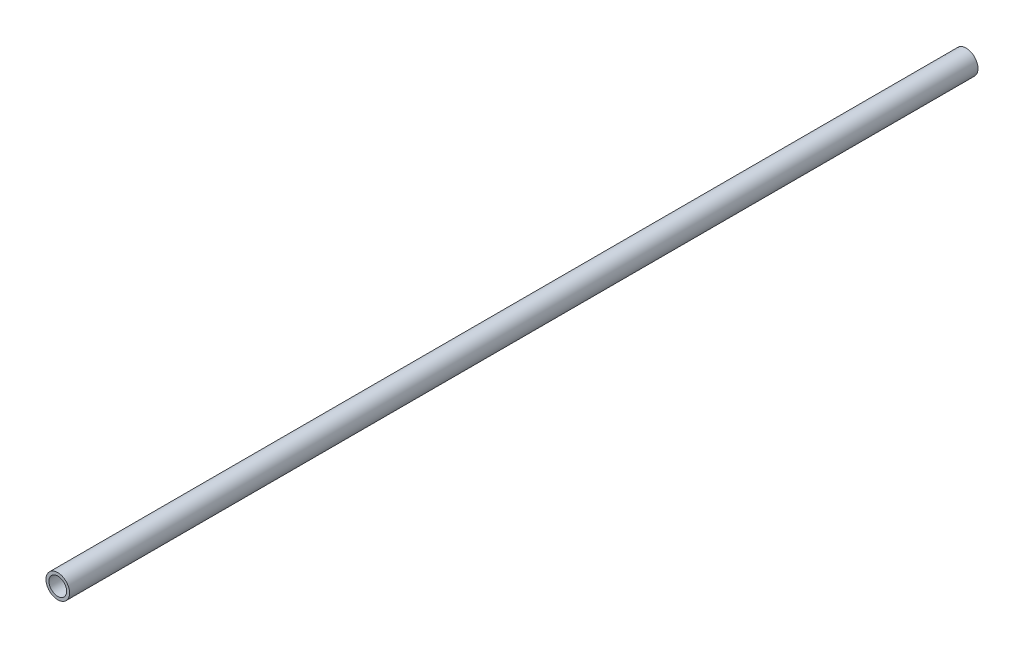
ISO-10303-21;
HEADER;
FILE_DESCRIPTION(('STEP AP214'),'2;1');
FILE_NAME('part.step','',(''),(''),'','','');
FILE_SCHEMA(('AUTOMOTIVE_DESIGN { 1 0 10303 214 1 1 1 1 }'));
ENDSEC;
DATA;
#1=APPLICATION_CONTEXT('core data for automotive mechanical design processes');
#2=APPLICATION_PROTOCOL_DEFINITION('international standard','automotive_design',2000,#1);
#3=PRODUCT_CONTEXT('',#1,'mechanical');
#4=PRODUCT('Part','Part','',(#3));
#5=PRODUCT_RELATED_PRODUCT_CATEGORY('part','',(#4));
#6=PRODUCT_DEFINITION_FORMATION('','',#4);
#7=PRODUCT_DEFINITION_CONTEXT('part definition',#1,'design');
#8=PRODUCT_DEFINITION('design','',#6,#7);
#9=PRODUCT_DEFINITION_SHAPE('','',#8);
#10=(LENGTH_UNIT() NAMED_UNIT(*) SI_UNIT(.MILLI.,.METRE.));
#11=(NAMED_UNIT(*) PLANE_ANGLE_UNIT() SI_UNIT($,.RADIAN.));
#12=(NAMED_UNIT(*) SI_UNIT($,.STERADIAN.) SOLID_ANGLE_UNIT());
#13=UNCERTAINTY_MEASURE_WITH_UNIT(LENGTH_MEASURE(1.E-05),#10,'distance_accuracy_value','');
#14=(GEOMETRIC_REPRESENTATION_CONTEXT(3) GLOBAL_UNCERTAINTY_ASSIGNED_CONTEXT((#13)) GLOBAL_UNIT_ASSIGNED_CONTEXT((#10,
#11,#12)) REPRESENTATION_CONTEXT('',''));
#15=CARTESIAN_POINT('',(0.,0.,0.));
#16=DIRECTION('',(0.,0.,1.));
#17=DIRECTION('',(1.,0.,0.));
#18=AXIS2_PLACEMENT_3D('',#15,#16,#17);
#19=CARTESIAN_POINT('',(0.,0.,308.));
#20=DIRECTION('',(0.,0.,1.));
#21=DIRECTION('',(1.,0.,0.));
#22=AXIS2_PLACEMENT_3D('',#19,#20,#21);
#23=PLANE('',#22);
#24=CARTESIAN_POINT('',(0.,0.,308.));
#25=DIRECTION('',(0.,0.,1.));
#26=DIRECTION('',(1.,0.,0.));
#27=AXIS2_PLACEMENT_3D('',#24,#25,#26);
#28=CIRCLE('',#27,4.);
#29=CARTESIAN_POINT('',(4.,0.,308.));
#30=VERTEX_POINT('',#29);
#31=EDGE_CURVE('E10',#30,#30,#28,.T.);
#32=ORIENTED_EDGE('',*,*,#31,.T.);
#33=EDGE_LOOP('',(#32));
#34=FACE_BOUND('',#33,.T.);
#35=CARTESIAN_POINT('',(0.,0.,308.));
#36=DIRECTION('',(0.,0.,1.));
#37=DIRECTION('',(1.,0.,0.));
#38=AXIS2_PLACEMENT_3D('',#35,#36,#37);
#39=CIRCLE('',#38,3.);
#40=CARTESIAN_POINT('',(3.,0.,308.));
#41=VERTEX_POINT('',#40);
#42=EDGE_CURVE('E48',#41,#41,#39,.T.);
#43=ORIENTED_EDGE('',*,*,#42,.F.);
#44=EDGE_LOOP('',(#43));
#45=FACE_BOUND('',#44,.T.);
#46=ADVANCED_FACE('F40',(#34,#45),#23,.T.);
#47=CARTESIAN_POINT('',(0.,0.,0.));
#48=DIRECTION('',(0.,0.,1.));
#49=DIRECTION('',(1.,0.,0.));
#50=AXIS2_PLACEMENT_3D('',#47,#48,#49);
#51=PLANE('',#50);
#52=CARTESIAN_POINT('',(0.,0.,0.));
#53=DIRECTION('',(0.,0.,1.));
#54=DIRECTION('',(1.,0.,0.));
#55=AXIS2_PLACEMENT_3D('',#52,#53,#54);
#56=CIRCLE('',#55,4.);
#57=CARTESIAN_POINT('',(4.,0.,0.));
#58=VERTEX_POINT('',#57);
#59=EDGE_CURVE('E41',#58,#58,#56,.T.);
#60=ORIENTED_EDGE('',*,*,#59,.F.);
#61=EDGE_LOOP('',(#60));
#62=FACE_BOUND('',#61,.T.);
#63=CARTESIAN_POINT('',(0.,0.,0.));
#64=DIRECTION('',(0.,0.,1.));
#65=DIRECTION('',(1.,0.,0.));
#66=AXIS2_PLACEMENT_3D('',#63,#64,#65);
#67=CIRCLE('',#66,3.);
#68=CARTESIAN_POINT('',(3.,0.,0.));
#69=VERTEX_POINT('',#68);
#70=EDGE_CURVE('E49',#69,#69,#67,.T.);
#71=ORIENTED_EDGE('',*,*,#70,.T.);
#72=EDGE_LOOP('',(#71));
#73=FACE_BOUND('',#72,.T.);
#74=ADVANCED_FACE('F58',(#62,#73),#51,.F.);
#75=CARTESIAN_POINT('',(0.,0.,308.));
#76=DIRECTION('',(0.,0.,-1.));
#77=DIRECTION('',(-1.,0.,0.));
#78=AXIS2_PLACEMENT_3D('',#75,#76,#77);
#79=CYLINDRICAL_SURFACE('',#78,4.);
#80=ORIENTED_EDGE('',*,*,#31,.F.);
#81=EDGE_LOOP('',(#80));
#82=FACE_BOUND('',#81,.T.);
#83=ORIENTED_EDGE('',*,*,#59,.T.);
#84=EDGE_LOOP('',(#83));
#85=FACE_BOUND('',#84,.T.);
#86=ADVANCED_FACE('F39',(#82,#85),#79,.T.);
#87=CARTESIAN_POINT('',(0.,0.,308.));
#88=DIRECTION('',(0.,0.,-1.));
#89=DIRECTION('',(-1.,0.,0.));
#90=AXIS2_PLACEMENT_3D('',#87,#88,#89);
#91=CYLINDRICAL_SURFACE('',#90,3.);
#92=ORIENTED_EDGE('',*,*,#42,.T.);
#93=EDGE_LOOP('',(#92));
#94=FACE_BOUND('',#93,.T.);
#95=ORIENTED_EDGE('',*,*,#70,.F.);
#96=EDGE_LOOP('',(#95));
#97=FACE_BOUND('',#96,.T.);
#98=ADVANCED_FACE('F57',(#94,#97),#91,.F.);
#99=CLOSED_SHELL('',(#46,#74,#86,#98));
#100=MANIFOLD_SOLID_BREP('B2',#99);
#101=ADVANCED_BREP_SHAPE_REPRESENTATION('',(#18,#100),#14);
#102=SHAPE_DEFINITION_REPRESENTATION(#9,#101);
ENDSEC;
END-ISO-10303-21;
